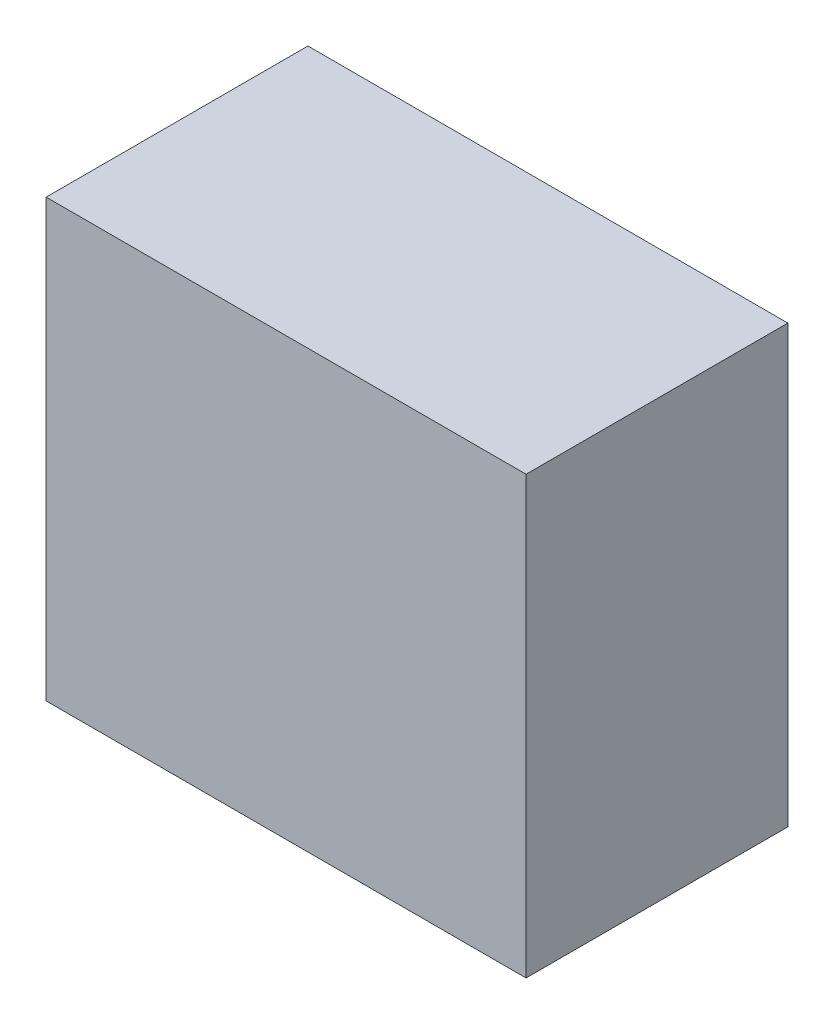
ISO-10303-21;
HEADER;
FILE_DESCRIPTION(('STEP AP214'),'2;1');
FILE_NAME('part.step','',(''),(''),'','','');
FILE_SCHEMA(('AUTOMOTIVE_DESIGN { 1 0 10303 214 1 1 1 1 }'));
ENDSEC;
DATA;
#1=APPLICATION_CONTEXT('core data for automotive mechanical design processes');
#2=APPLICATION_PROTOCOL_DEFINITION('international standard','automotive_design',2000,#1);
#3=PRODUCT_CONTEXT('',#1,'mechanical');
#4=PRODUCT('Part','Part','',(#3));
#5=PRODUCT_RELATED_PRODUCT_CATEGORY('part','',(#4));
#6=PRODUCT_DEFINITION_FORMATION('','',#4);
#7=PRODUCT_DEFINITION_CONTEXT('part definition',#1,'design');
#8=PRODUCT_DEFINITION('design','',#6,#7);
#9=PRODUCT_DEFINITION_SHAPE('','',#8);
#10=(LENGTH_UNIT() NAMED_UNIT(*) SI_UNIT(.MILLI.,.METRE.));
#11=(NAMED_UNIT(*) PLANE_ANGLE_UNIT() SI_UNIT($,.RADIAN.));
#12=(NAMED_UNIT(*) SI_UNIT($,.STERADIAN.) SOLID_ANGLE_UNIT());
#13=UNCERTAINTY_MEASURE_WITH_UNIT(LENGTH_MEASURE(1.E-05),#10,'distance_accuracy_value','');
#14=(GEOMETRIC_REPRESENTATION_CONTEXT(3) GLOBAL_UNCERTAINTY_ASSIGNED_CONTEXT((#13)) GLOBAL_UNIT_ASSIGNED_CONTEXT((#10,
#11,#12)) REPRESENTATION_CONTEXT('',''));
#15=CARTESIAN_POINT('',(0.,0.,0.));
#16=DIRECTION('',(0.,0.,1.));
#17=DIRECTION('',(1.,0.,0.));
#18=AXIS2_PLACEMENT_3D('',#15,#16,#17);
#19=CARTESIAN_POINT('',(-55.,-50.,30.));
#20=DIRECTION('',(1.,0.,0.));
#21=DIRECTION('',(0.,0.,-1.));
#22=AXIS2_PLACEMENT_3D('',#19,#20,#21);
#23=PLANE('',#22);
#24=DIRECTION('',(0.,-1.,0.));
#25=VECTOR('',#24,1.);
#26=CARTESIAN_POINT('',(-55.,-50.,-30.));
#27=LINE('',#26,#25);
#28=CARTESIAN_POINT('',(-55.,50.,-30.));
#29=VERTEX_POINT('',#28);
#30=CARTESIAN_POINT('',(-55.,-50.,-30.));
#31=VERTEX_POINT('',#30);
#32=EDGE_CURVE('E107',#29,#31,#27,.T.);
#33=ORIENTED_EDGE('',*,*,#32,.T.);
#34=DIRECTION('',(0.,0.,-1.));
#35=VECTOR('',#34,1.);
#36=CARTESIAN_POINT('',(-55.,-50.,30.));
#37=LINE('',#36,#35);
#38=CARTESIAN_POINT('',(-55.,-50.,30.));
#39=VERTEX_POINT('',#38);
#40=EDGE_CURVE('E11',#39,#31,#37,.T.);
#41=ORIENTED_EDGE('',*,*,#40,.F.);
#42=DIRECTION('',(0.,-1.,0.));
#43=VECTOR('',#42,1.);
#44=CARTESIAN_POINT('',(-55.,-50.,30.));
#45=LINE('',#44,#43);
#46=CARTESIAN_POINT('',(-55.,50.,30.));
#47=VERTEX_POINT('',#46);
#48=EDGE_CURVE('E91',#47,#39,#45,.T.);
#49=ORIENTED_EDGE('',*,*,#48,.F.);
#50=DIRECTION('',(0.,0.,-1.));
#51=VECTOR('',#50,1.);
#52=CARTESIAN_POINT('',(-55.,50.,30.));
#53=LINE('',#52,#51);
#54=EDGE_CURVE('E103',#47,#29,#53,.T.);
#55=ORIENTED_EDGE('',*,*,#54,.T.);
#56=EDGE_LOOP('',(#33,#41,#49,#55));
#57=FACE_BOUND('',#56,.T.);
#58=ADVANCED_FACE('F39',(#57),#23,.F.);
#59=CARTESIAN_POINT('',(55.,-50.,30.));
#60=DIRECTION('',(0.,1.,0.));
#61=DIRECTION('',(-1.,0.,0.));
#62=AXIS2_PLACEMENT_3D('',#59,#60,#61);
#63=PLANE('',#62);
#64=DIRECTION('',(1.,0.,0.));
#65=VECTOR('',#64,1.);
#66=CARTESIAN_POINT('',(55.,-50.,-30.));
#67=LINE('',#66,#65);
#68=CARTESIAN_POINT('',(55.,-50.,-30.));
#69=VERTEX_POINT('',#68);
#70=EDGE_CURVE('E96',#31,#69,#67,.T.);
#71=ORIENTED_EDGE('',*,*,#70,.T.);
#72=DIRECTION('',(0.,0.,-1.));
#73=VECTOR('',#72,1.);
#74=CARTESIAN_POINT('',(55.,-50.,30.));
#75=LINE('',#74,#73);
#76=CARTESIAN_POINT('',(55.,-50.,30.));
#77=VERTEX_POINT('',#76);
#78=EDGE_CURVE('E48',#77,#69,#75,.T.);
#79=ORIENTED_EDGE('',*,*,#78,.F.);
#80=DIRECTION('',(1.,0.,0.));
#81=VECTOR('',#80,1.);
#82=CARTESIAN_POINT('',(55.,-50.,30.));
#83=LINE('',#82,#81);
#84=EDGE_CURVE('E86',#39,#77,#83,.T.);
#85=ORIENTED_EDGE('',*,*,#84,.F.);
#86=ORIENTED_EDGE('',*,*,#40,.T.);
#87=EDGE_LOOP('',(#71,#79,#85,#86));
#88=FACE_BOUND('',#87,.T.);
#89=ADVANCED_FACE('F95',(#88),#63,.F.);
#90=CARTESIAN_POINT('',(55.,-50.,30.));
#91=DIRECTION('',(-1.,0.,0.));
#92=DIRECTION('',(0.,0.,1.));
#93=AXIS2_PLACEMENT_3D('',#90,#91,#92);
#94=PLANE('',#93);
#95=DIRECTION('',(0.,1.,0.));
#96=VECTOR('',#95,1.);
#97=CARTESIAN_POINT('',(55.,-50.,-30.));
#98=LINE('',#97,#96);
#99=CARTESIAN_POINT('',(55.,50.,-30.));
#100=VERTEX_POINT('',#99);
#101=EDGE_CURVE('E73',#69,#100,#98,.T.);
#102=ORIENTED_EDGE('',*,*,#101,.T.);
#103=DIRECTION('',(0.,0.,-1.));
#104=VECTOR('',#103,1.);
#105=CARTESIAN_POINT('',(55.,50.,30.));
#106=LINE('',#105,#104);
#107=CARTESIAN_POINT('',(55.,50.,30.));
#108=VERTEX_POINT('',#107);
#109=EDGE_CURVE('E98',#108,#100,#106,.T.);
#110=ORIENTED_EDGE('',*,*,#109,.F.);
#111=DIRECTION('',(0.,1.,0.));
#112=VECTOR('',#111,1.);
#113=CARTESIAN_POINT('',(55.,-50.,30.));
#114=LINE('',#113,#112);
#115=EDGE_CURVE('E89',#77,#108,#114,.T.);
#116=ORIENTED_EDGE('',*,*,#115,.F.);
#117=ORIENTED_EDGE('',*,*,#78,.T.);
#118=EDGE_LOOP('',(#102,#110,#116,#117));
#119=FACE_BOUND('',#118,.T.);
#120=ADVANCED_FACE('F99',(#119),#94,.F.);
#121=CARTESIAN_POINT('',(55.,50.,30.));
#122=DIRECTION('',(0.,-1.,0.));
#123=DIRECTION('',(1.,0.,0.));
#124=AXIS2_PLACEMENT_3D('',#121,#122,#123);
#125=PLANE('',#124);
#126=DIRECTION('',(-1.,0.,0.));
#127=VECTOR('',#126,1.);
#128=CARTESIAN_POINT('',(55.,50.,-30.));
#129=LINE('',#128,#127);
#130=EDGE_CURVE('E79',#100,#29,#129,.T.);
#131=ORIENTED_EDGE('',*,*,#130,.T.);
#132=ORIENTED_EDGE('',*,*,#54,.F.);
#133=DIRECTION('',(-1.,0.,0.));
#134=VECTOR('',#133,1.);
#135=CARTESIAN_POINT('',(55.,50.,30.));
#136=LINE('',#135,#134);
#137=EDGE_CURVE('E56',#108,#47,#136,.T.);
#138=ORIENTED_EDGE('',*,*,#137,.F.);
#139=ORIENTED_EDGE('',*,*,#109,.T.);
#140=EDGE_LOOP('',(#131,#132,#138,#139));
#141=FACE_BOUND('',#140,.T.);
#142=ADVANCED_FACE('F120',(#141),#125,.F.);
#143=CARTESIAN_POINT('',(0.,0.,30.));
#144=DIRECTION('',(0.,0.,1.));
#145=DIRECTION('',(1.,0.,0.));
#146=AXIS2_PLACEMENT_3D('',#143,#144,#145);
#147=PLANE('',#146);
#148=ORIENTED_EDGE('',*,*,#48,.T.);
#149=ORIENTED_EDGE('',*,*,#84,.T.);
#150=ORIENTED_EDGE('',*,*,#115,.T.);
#151=ORIENTED_EDGE('',*,*,#137,.T.);
#152=EDGE_LOOP('',(#148,#149,#150,#151));
#153=FACE_BOUND('',#152,.T.);
#154=ADVANCED_FACE('F87',(#153),#147,.T.);
#155=CARTESIAN_POINT('',(0.,0.,-30.));
#156=DIRECTION('',(0.,0.,1.));
#157=DIRECTION('',(1.,0.,0.));
#158=AXIS2_PLACEMENT_3D('',#155,#156,#157);
#159=PLANE('',#158);
#160=ORIENTED_EDGE('',*,*,#32,.F.);
#161=ORIENTED_EDGE('',*,*,#130,.F.);
#162=ORIENTED_EDGE('',*,*,#101,.F.);
#163=ORIENTED_EDGE('',*,*,#70,.F.);
#164=EDGE_LOOP('',(#160,#161,#162,#163));
#165=FACE_BOUND('',#164,.T.);
#166=ADVANCED_FACE('F123',(#165),#159,.F.);
#167=CLOSED_SHELL('',(#58,#89,#120,#142,#154,#166));
#168=MANIFOLD_SOLID_BREP('B2',#167);
#169=ADVANCED_BREP_SHAPE_REPRESENTATION('',(#18,#168),#14);
#170=SHAPE_DEFINITION_REPRESENTATION(#9,#169);
ENDSEC;
END-ISO-10303-21;
